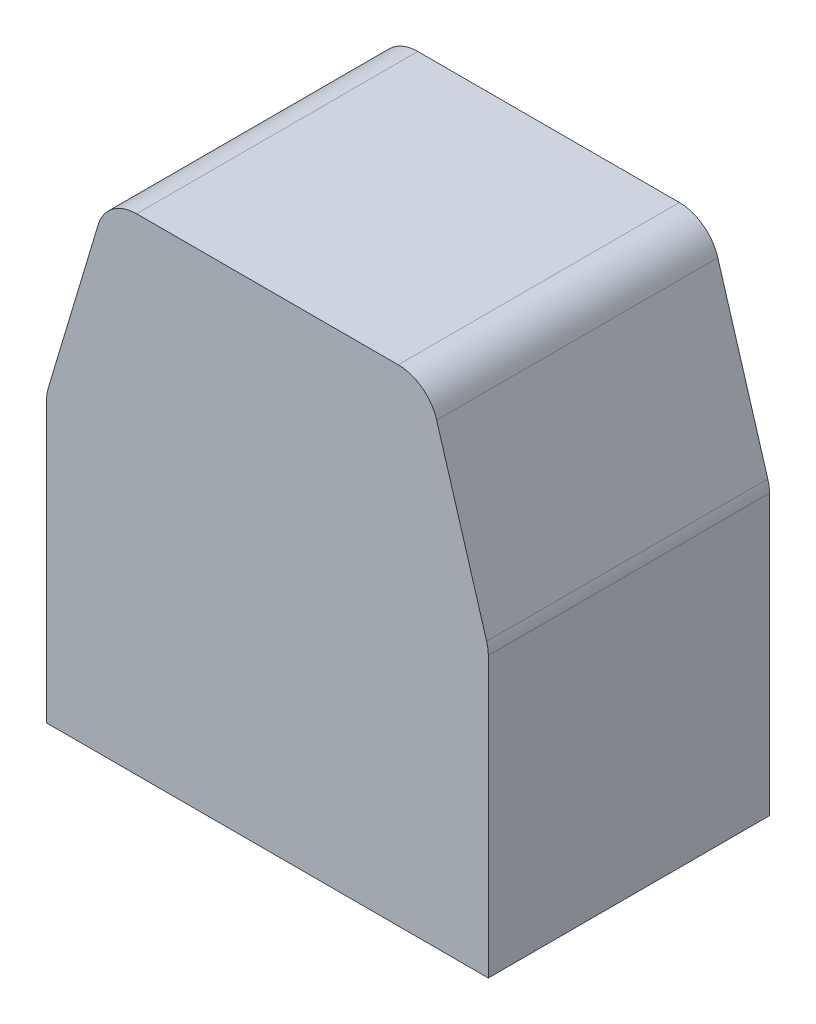
ISO-10303-21;
HEADER;
FILE_DESCRIPTION(('STEP AP214'),'2;1');
FILE_NAME('part.step','',(''),(''),'','','');
FILE_SCHEMA(('AUTOMOTIVE_DESIGN { 1 0 10303 214 1 1 1 1 }'));
ENDSEC;
DATA;
#1=APPLICATION_CONTEXT('core data for automotive mechanical design processes');
#2=APPLICATION_PROTOCOL_DEFINITION('international standard','automotive_design',2000,#1);
#3=PRODUCT_CONTEXT('',#1,'mechanical');
#4=PRODUCT('Part','Part','',(#3));
#5=PRODUCT_RELATED_PRODUCT_CATEGORY('part','',(#4));
#6=PRODUCT_DEFINITION_FORMATION('','',#4);
#7=PRODUCT_DEFINITION_CONTEXT('part definition',#1,'design');
#8=PRODUCT_DEFINITION('design','',#6,#7);
#9=PRODUCT_DEFINITION_SHAPE('','',#8);
#10=(LENGTH_UNIT() NAMED_UNIT(*) SI_UNIT(.MILLI.,.METRE.));
#11=(NAMED_UNIT(*) PLANE_ANGLE_UNIT() SI_UNIT($,.RADIAN.));
#12=(NAMED_UNIT(*) SI_UNIT($,.STERADIAN.) SOLID_ANGLE_UNIT());
#13=UNCERTAINTY_MEASURE_WITH_UNIT(LENGTH_MEASURE(1.E-05),#10,'distance_accuracy_value','');
#14=(GEOMETRIC_REPRESENTATION_CONTEXT(3) GLOBAL_UNCERTAINTY_ASSIGNED_CONTEXT((#13)) GLOBAL_UNIT_ASSIGNED_CONTEXT((#10,
#11,#12)) REPRESENTATION_CONTEXT('',''));
#15=CARTESIAN_POINT('',(0.,0.,0.));
#16=DIRECTION('',(0.,0.,1.));
#17=DIRECTION('',(1.,0.,0.));
#18=AXIS2_PLACEMENT_3D('',#15,#16,#17);
#19=CARTESIAN_POINT('',(-29.0596934910895,70.5,70.));
#20=DIRECTION('',(0.,0.,-1.));
#21=DIRECTION('',(-1.,0.,0.));
#22=AXIS2_PLACEMENT_3D('',#19,#20,#21);
#23=CYLINDRICAL_SURFACE('',#22,9.99999999999999);
#24=DIRECTION('',(0.,0.,-1.));
#25=VECTOR('',#24,1.);
#26=CARTESIAN_POINT('',(-29.0596934910895,80.5,70.));
#27=LINE('',#26,#25);
#28=CARTESIAN_POINT('',(-29.0596934910895,80.5,65.));
#29=VERTEX_POINT('',#28);
#30=CARTESIAN_POINT('',(-29.0596934910895,80.5,0.));
#31=VERTEX_POINT('',#30);
#32=EDGE_CURVE('E11',#29,#31,#27,.T.);
#33=ORIENTED_EDGE('',*,*,#32,.F.);
#34=CARTESIAN_POINT('',(-29.0596934910895,70.5,65.));
#35=DIRECTION('',(0.,0.,1.));
#36=DIRECTION('',(1.,0.,0.));
#37=AXIS2_PLACEMENT_3D('',#34,#35,#36);
#38=CIRCLE('',#37,9.99999999999999);
#39=CARTESIAN_POINT('',(-38.637956343301,73.3734788556635,65.));
#40=VERTEX_POINT('',#39);
#41=EDGE_CURVE('E511',#29,#40,#38,.T.);
#42=ORIENTED_EDGE('',*,*,#41,.T.);
#43=DIRECTION('',(0.,0.,-1.));
#44=VECTOR('',#43,1.);
#45=CARTESIAN_POINT('',(-38.637956343301,73.3734788556635,70.));
#46=LINE('',#45,#44);
#47=CARTESIAN_POINT('',(-38.637956343301,73.3734788556635,0.));
#48=VERTEX_POINT('',#47);
#49=EDGE_CURVE('E152',#40,#48,#46,.T.);
#50=ORIENTED_EDGE('',*,*,#49,.T.);
#51=CARTESIAN_POINT('',(-29.0596934910895,70.5,0.));
#52=DIRECTION('',(0.,0.,1.));
#53=DIRECTION('',(1.,0.,0.));
#54=AXIS2_PLACEMENT_3D('',#51,#52,#53);
#55=CIRCLE('',#54,9.99999999999999);
#56=EDGE_CURVE('E215',#31,#48,#55,.T.);
#57=ORIENTED_EDGE('',*,*,#56,.F.);
#58=EDGE_LOOP('',(#33,#42,#50,#57));
#59=FACE_BOUND('',#58,.T.);
#60=ADVANCED_FACE('F43',(#59),#23,.F.);
#61=CARTESIAN_POINT('',(0.,80.5,70.));
#62=DIRECTION('',(0.,1.,0.));
#63=DIRECTION('',(0.,0.,1.));
#64=AXIS2_PLACEMENT_3D('',#61,#62,#63);
#65=PLANE('',#64);
#66=DIRECTION('',(-1.,0.,0.));
#67=VECTOR('',#66,1.);
#68=CARTESIAN_POINT('',(-29.0596934910895,80.5,65.));
#69=LINE('',#68,#67);
#70=CARTESIAN_POINT('',(29.0596934910895,80.5,65.));
#71=VERTEX_POINT('',#70);
#72=EDGE_CURVE('E525',#71,#29,#69,.T.);
#73=ORIENTED_EDGE('',*,*,#72,.T.);
#74=ORIENTED_EDGE('',*,*,#32,.T.);
#75=DIRECTION('',(1.,0.,0.));
#76=VECTOR('',#75,1.);
#77=CARTESIAN_POINT('',(0.,80.5,0.));
#78=LINE('',#77,#76);
#79=CARTESIAN_POINT('',(29.0596934910895,80.5,0.));
#80=VERTEX_POINT('',#79);
#81=EDGE_CURVE('E219',#31,#80,#78,.T.);
#82=ORIENTED_EDGE('',*,*,#81,.T.);
#83=DIRECTION('',(0.,0.,-1.));
#84=VECTOR('',#83,1.);
#85=CARTESIAN_POINT('',(29.0596934910895,80.5,70.));
#86=LINE('',#85,#84);
#87=EDGE_CURVE('E52',#71,#80,#86,.T.);
#88=ORIENTED_EDGE('',*,*,#87,.F.);
#89=EDGE_LOOP('',(#73,#74,#82,#88));
#90=FACE_BOUND('',#89,.T.);
#91=ADVANCED_FACE('F389',(#90),#65,.F.);
#92=CARTESIAN_POINT('',(29.0596934910895,70.5,70.));
#93=DIRECTION('',(0.,0.,-1.));
#94=DIRECTION('',(-1.,0.,0.));
#95=AXIS2_PLACEMENT_3D('',#92,#93,#94);
#96=CYLINDRICAL_SURFACE('',#95,9.99999999999998);
#97=DIRECTION('',(0.,0.,-1.));
#98=VECTOR('',#97,1.);
#99=CARTESIAN_POINT('',(38.6379563433009,73.3734788556635,70.));
#100=LINE('',#99,#98);
#101=CARTESIAN_POINT('',(38.6379563433009,73.3734788556635,65.));
#102=VERTEX_POINT('',#101);
#103=CARTESIAN_POINT('',(38.6379563433009,73.3734788556635,0.));
#104=VERTEX_POINT('',#103);
#105=EDGE_CURVE('E374',#102,#104,#100,.T.);
#106=ORIENTED_EDGE('',*,*,#105,.F.);
#107=CARTESIAN_POINT('',(29.0596934910895,70.5,65.));
#108=DIRECTION('',(0.,0.,1.));
#109=DIRECTION('',(1.,0.,0.));
#110=AXIS2_PLACEMENT_3D('',#107,#108,#109);
#111=CIRCLE('',#110,9.99999999999998);
#112=EDGE_CURVE('E385',#102,#71,#111,.T.);
#113=ORIENTED_EDGE('',*,*,#112,.T.);
#114=ORIENTED_EDGE('',*,*,#87,.T.);
#115=CARTESIAN_POINT('',(29.0596934910895,70.5,0.));
#116=DIRECTION('',(0.,0.,1.));
#117=DIRECTION('',(1.,0.,0.));
#118=AXIS2_PLACEMENT_3D('',#115,#116,#117);
#119=CIRCLE('',#118,9.99999999999998);
#120=EDGE_CURVE('E224',#104,#80,#119,.T.);
#121=ORIENTED_EDGE('',*,*,#120,.F.);
#122=EDGE_LOOP('',(#106,#113,#114,#121));
#123=FACE_BOUND('',#122,.T.);
#124=ADVANCED_FACE('F382',(#123),#96,.F.);
#125=CARTESIAN_POINT('',(55.6422018348624,16.6926605504587,70.));
#126=DIRECTION('',(0.957826285221151,0.287347885566345,0.));
#127=DIRECTION('',(-0.287347885566345,0.957826285221152,0.));
#128=AXIS2_PLACEMENT_3D('',#125,#126,#127);
#129=PLANE('',#128);
#130=DIRECTION('',(-0.287347885566345,0.957826285221152,0.));
#131=VECTOR('',#130,1.);
#132=CARTESIAN_POINT('',(38.6379563433009,73.3734788556635,65.));
#133=LINE('',#132,#131);
#134=CARTESIAN_POINT('',(50.,35.4999999999998,65.));
#135=VERTEX_POINT('',#134);
#136=EDGE_CURVE('E403',#135,#102,#133,.T.);
#137=ORIENTED_EDGE('',*,*,#136,.T.);
#138=ORIENTED_EDGE('',*,*,#105,.T.);
#139=DIRECTION('',(0.287347885566345,-0.957826285221152,0.));
#140=VECTOR('',#139,1.);
#141=CARTESIAN_POINT('',(55.6422018348624,16.6926605504587,0.));
#142=LINE('',#141,#140);
#143=CARTESIAN_POINT('',(50.,35.4999999999998,0.));
#144=VERTEX_POINT('',#143);
#145=EDGE_CURVE('E228',#104,#144,#142,.T.);
#146=ORIENTED_EDGE('',*,*,#145,.T.);
#147=DIRECTION('',(0.,0.,-1.));
#148=VECTOR('',#147,1.);
#149=CARTESIAN_POINT('',(50.,35.4999999999998,70.));
#150=LINE('',#149,#148);
#151=EDGE_CURVE('E371',#135,#144,#150,.T.);
#152=ORIENTED_EDGE('',*,*,#151,.F.);
#153=EDGE_LOOP('',(#137,#138,#146,#152));
#154=FACE_BOUND('',#153,.T.);
#155=ADVANCED_FACE('F399',(#154),#129,.F.);
#156=CARTESIAN_POINT('',(49.9999999999999,-2.41809939075555E-13,70.));
#157=DIRECTION('',(1.,0.,0.));
#158=DIRECTION('',(0.,1.,0.));
#159=AXIS2_PLACEMENT_3D('',#156,#157,#158);
#160=PLANE('',#159);
#161=DIRECTION('',(0.,1.,0.));
#162=VECTOR('',#161,1.);
#163=CARTESIAN_POINT('',(50.,35.4999999999998,65.));
#164=LINE('',#163,#162);
#165=CARTESIAN_POINT('',(49.9999999999997,-30.5,65.));
#166=VERTEX_POINT('',#165);
#167=EDGE_CURVE('E534',#166,#135,#164,.T.);
#168=ORIENTED_EDGE('',*,*,#167,.T.);
#169=ORIENTED_EDGE('',*,*,#151,.T.);
#170=DIRECTION('',(0.,-1.,0.));
#171=VECTOR('',#170,1.);
#172=CARTESIAN_POINT('',(49.9999999999999,-2.41809939075555E-13,0.));
#173=LINE('',#172,#171);
#174=CARTESIAN_POINT('',(49.9999999999997,-30.5,0.));
#175=VERTEX_POINT('',#174);
#176=EDGE_CURVE('E232',#144,#175,#173,.T.);
#177=ORIENTED_EDGE('',*,*,#176,.T.);
#178=DIRECTION('',(0.,0.,-1.));
#179=VECTOR('',#178,1.);
#180=CARTESIAN_POINT('',(49.9999999999997,-30.5,70.));
#181=LINE('',#180,#179);
#182=EDGE_CURVE('E368',#166,#175,#181,.T.);
#183=ORIENTED_EDGE('',*,*,#182,.F.);
#184=EDGE_LOOP('',(#168,#169,#177,#183));
#185=FACE_BOUND('',#184,.T.);
#186=ADVANCED_FACE('F600',(#185),#160,.F.);
#187=CARTESIAN_POINT('',(25.7068874077128,-44.5256350946108,70.));
#188=DIRECTION('',(-0.500000000000002,0.866025403784437,0.));
#189=DIRECTION('',(-0.866025403784437,-0.500000000000002,0.));
#190=AXIS2_PLACEMENT_3D('',#187,#188,#189);
#191=PLANE('',#190);
#192=DIRECTION('',(-0.866025403784437,-0.500000000000002,0.));
#193=VECTOR('',#192,1.);
#194=CARTESIAN_POINT('',(49.9999999999997,-30.5,65.));
#195=LINE('',#194,#193);
#196=CARTESIAN_POINT('',(52.598076211353,-29.,65.));
#197=VERTEX_POINT('',#196);
#198=EDGE_CURVE('E538',#197,#166,#195,.T.);
#199=ORIENTED_EDGE('',*,*,#198,.T.);
#200=ORIENTED_EDGE('',*,*,#182,.T.);
#201=DIRECTION('',(0.866025403784437,0.500000000000002,0.));
#202=VECTOR('',#201,1.);
#203=CARTESIAN_POINT('',(25.7068874077128,-44.5256350946108,0.));
#204=LINE('',#203,#202);
#205=CARTESIAN_POINT('',(52.598076211353,-29.,0.));
#206=VERTEX_POINT('',#205);
#207=EDGE_CURVE('E236',#175,#206,#204,.T.);
#208=ORIENTED_EDGE('',*,*,#207,.T.);
#209=DIRECTION('',(0.,0.,-1.));
#210=VECTOR('',#209,1.);
#211=CARTESIAN_POINT('',(52.598076211353,-29.,70.));
#212=LINE('',#211,#210);
#213=EDGE_CURVE('E365',#197,#206,#212,.T.);
#214=ORIENTED_EDGE('',*,*,#213,.F.);
#215=EDGE_LOOP('',(#199,#200,#208,#214));
#216=FACE_BOUND('',#215,.T.);
#217=ADVANCED_FACE('F596',(#216),#191,.F.);
#218=CARTESIAN_POINT('',(52.598076211353,0.,70.));
#219=DIRECTION('',(1.,0.,0.));
#220=DIRECTION('',(0.,0.,-1.));
#221=AXIS2_PLACEMENT_3D('',#218,#219,#220);
#222=PLANE('',#221);
#223=DIRECTION('',(0.,1.,0.));
#224=VECTOR('',#223,1.);
#225=CARTESIAN_POINT('',(52.598076211353,-29.,65.));
#226=LINE('',#225,#224);
#227=CARTESIAN_POINT('',(52.598076211353,-34.,65.));
#228=VERTEX_POINT('',#227);
#229=EDGE_CURVE('E542',#228,#197,#226,.T.);
#230=ORIENTED_EDGE('',*,*,#229,.T.);
#231=ORIENTED_EDGE('',*,*,#213,.T.);
#232=DIRECTION('',(0.,-1.,0.));
#233=VECTOR('',#232,1.);
#234=CARTESIAN_POINT('',(52.598076211353,0.,0.));
#235=LINE('',#234,#233);
#236=CARTESIAN_POINT('',(52.598076211353,-34.,0.));
#237=VERTEX_POINT('',#236);
#238=EDGE_CURVE('E240',#206,#237,#235,.T.);
#239=ORIENTED_EDGE('',*,*,#238,.T.);
#240=DIRECTION('',(0.,0.,-1.));
#241=VECTOR('',#240,1.);
#242=CARTESIAN_POINT('',(52.598076211353,-34.,70.));
#243=LINE('',#242,#241);
#244=EDGE_CURVE('E362',#228,#237,#243,.T.);
#245=ORIENTED_EDGE('',*,*,#244,.F.);
#246=EDGE_LOOP('',(#230,#231,#239,#245));
#247=FACE_BOUND('',#246,.T.);
#248=ADVANCED_FACE('F592',(#247),#222,.F.);
#249=CARTESIAN_POINT('',(-1.57291281149709,-2.72436490538894,70.));
#250=DIRECTION('',(-0.500000000000004,-0.866025403784437,0.));
#251=DIRECTION('',(0.866025403784437,-0.500000000000004,0.));
#252=AXIS2_PLACEMENT_3D('',#249,#250,#251);
#253=PLANE('',#252);
#254=DIRECTION('',(0.866025403784437,-0.500000000000004,0.));
#255=VECTOR('',#254,1.);
#256=CARTESIAN_POINT('',(52.598076211353,-34.,65.));
#257=LINE('',#256,#255);
#258=CARTESIAN_POINT('',(49.9999999999997,-32.5,65.));
#259=VERTEX_POINT('',#258);
#260=EDGE_CURVE('E546',#259,#228,#257,.T.);
#261=ORIENTED_EDGE('',*,*,#260,.T.);
#262=ORIENTED_EDGE('',*,*,#244,.T.);
#263=DIRECTION('',(-0.866025403784437,0.500000000000004,0.));
#264=VECTOR('',#263,1.);
#265=CARTESIAN_POINT('',(-1.57291281149709,-2.72436490538894,0.));
#266=LINE('',#265,#264);
#267=CARTESIAN_POINT('',(49.9999999999997,-32.5,0.));
#268=VERTEX_POINT('',#267);
#269=EDGE_CURVE('E244',#237,#268,#266,.T.);
#270=ORIENTED_EDGE('',*,*,#269,.T.);
#271=DIRECTION('',(0.,0.,-1.));
#272=VECTOR('',#271,1.);
#273=CARTESIAN_POINT('',(49.9999999999997,-32.5,70.));
#274=LINE('',#273,#272);
#275=EDGE_CURVE('E359',#259,#268,#274,.T.);
#276=ORIENTED_EDGE('',*,*,#275,.F.);
#277=EDGE_LOOP('',(#261,#262,#270,#276));
#278=FACE_BOUND('',#277,.T.);
#279=ADVANCED_FACE('F589',(#278),#253,.F.);
#280=CARTESIAN_POINT('',(49.9999999999998,-2.15007980121054E-13,70.));
#281=DIRECTION('',(1.,0.,0.));
#282=DIRECTION('',(0.,1.,0.));
#283=AXIS2_PLACEMENT_3D('',#280,#281,#282);
#284=PLANE('',#283);
#285=DIRECTION('',(0.,1.,0.));
#286=VECTOR('',#285,1.);
#287=CARTESIAN_POINT('',(49.9999999999997,-32.5,65.));
#288=LINE('',#287,#286);
#289=CARTESIAN_POINT('',(49.9999999999997,-35.5,65.));
#290=VERTEX_POINT('',#289);
#291=EDGE_CURVE('E550',#290,#259,#288,.T.);
#292=ORIENTED_EDGE('',*,*,#291,.T.);
#293=ORIENTED_EDGE('',*,*,#275,.T.);
#294=DIRECTION('',(0.,-1.,0.));
#295=VECTOR('',#294,1.);
#296=CARTESIAN_POINT('',(49.9999999999998,-2.15007980121054E-13,0.));
#297=LINE('',#296,#295);
#298=CARTESIAN_POINT('',(49.9999999999997,-35.5,0.));
#299=VERTEX_POINT('',#298);
#300=EDGE_CURVE('E248',#268,#299,#297,.T.);
#301=ORIENTED_EDGE('',*,*,#300,.T.);
#302=DIRECTION('',(0.,0.,-1.));
#303=VECTOR('',#302,1.);
#304=CARTESIAN_POINT('',(49.9999999999997,-35.5,70.));
#305=LINE('',#304,#303);
#306=EDGE_CURVE('E356',#290,#299,#305,.T.);
#307=ORIENTED_EDGE('',*,*,#306,.F.);
#308=EDGE_LOOP('',(#292,#293,#301,#307));
#309=FACE_BOUND('',#308,.T.);
#310=ADVANCED_FACE('F561',(#309),#284,.F.);
#311=CARTESIAN_POINT('',(-49.9999999999999,1.07503990060534E-13,70.));
#312=DIRECTION('',(1.,0.,0.));
#313=DIRECTION('',(0.,1.,0.));
#314=AXIS2_PLACEMENT_3D('',#311,#312,#313);
#315=PLANE('',#314);
#316=DIRECTION('',(0.,0.,-1.));
#317=VECTOR('',#316,1.);
#318=CARTESIAN_POINT('',(-50.,-32.5,70.));
#319=LINE('',#318,#317);
#320=CARTESIAN_POINT('',(-50.,-32.5,65.));
#321=VERTEX_POINT('',#320);
#322=CARTESIAN_POINT('',(-50.,-32.5,0.));
#323=VERTEX_POINT('',#322);
#324=EDGE_CURVE('E325',#321,#323,#319,.T.);
#325=ORIENTED_EDGE('',*,*,#324,.F.);
#326=DIRECTION('',(0.,-1.,0.));
#327=VECTOR('',#326,1.);
#328=CARTESIAN_POINT('',(-50.,-35.5,65.));
#329=LINE('',#328,#327);
#330=CARTESIAN_POINT('',(-50.,-35.5,65.));
#331=VERTEX_POINT('',#330);
#332=EDGE_CURVE('E433',#321,#331,#329,.T.);
#333=ORIENTED_EDGE('',*,*,#332,.T.);
#334=DIRECTION('',(0.,0.,-1.));
#335=VECTOR('',#334,1.);
#336=CARTESIAN_POINT('',(-50.,-35.5,70.));
#337=LINE('',#336,#335);
#338=CARTESIAN_POINT('',(-50.,-35.5,0.));
#339=VERTEX_POINT('',#338);
#340=EDGE_CURVE('E328',#331,#339,#337,.T.);
#341=ORIENTED_EDGE('',*,*,#340,.T.);
#342=DIRECTION('',(0.,-1.,0.));
#343=VECTOR('',#342,1.);
#344=CARTESIAN_POINT('',(-49.9999999999999,1.07503990060534E-13,0.));
#345=LINE('',#344,#343);
#346=EDGE_CURVE('E289',#323,#339,#345,.T.);
#347=ORIENTED_EDGE('',*,*,#346,.F.);
#348=EDGE_LOOP('',(#325,#333,#341,#347));
#349=FACE_BOUND('',#348,.T.);
#350=ADVANCED_FACE('F452',(#349),#315,.T.);
#351=CARTESIAN_POINT('',(1.57291281149704,-2.72436490538885,70.));
#352=DIRECTION('',(-0.500000000000003,0.866025403784437,0.));
#353=DIRECTION('',(-0.866025403784437,-0.500000000000003,0.));
#354=AXIS2_PLACEMENT_3D('',#351,#352,#353);
#355=PLANE('',#354);
#356=DIRECTION('',(0.,0.,-1.));
#357=VECTOR('',#356,1.);
#358=CARTESIAN_POINT('',(-52.5980762113533,-34.,70.));
#359=LINE('',#358,#357);
#360=CARTESIAN_POINT('',(-52.5980762113533,-34.,65.));
#361=VERTEX_POINT('',#360);
#362=CARTESIAN_POINT('',(-52.5980762113533,-34.,0.));
#363=VERTEX_POINT('',#362);
#364=EDGE_CURVE('E322',#361,#363,#359,.T.);
#365=ORIENTED_EDGE('',*,*,#364,.F.);
#366=DIRECTION('',(0.866025403784437,0.500000000000003,0.));
#367=VECTOR('',#366,1.);
#368=CARTESIAN_POINT('',(-50.,-32.5,65.));
#369=LINE('',#368,#367);
#370=EDGE_CURVE('E220',#361,#321,#369,.T.);
#371=ORIENTED_EDGE('',*,*,#370,.T.);
#372=ORIENTED_EDGE('',*,*,#324,.T.);
#373=DIRECTION('',(0.866025403784437,0.500000000000003,0.));
#374=VECTOR('',#373,1.);
#375=CARTESIAN_POINT('',(1.57291281149704,-2.72436490538885,0.));
#376=LINE('',#375,#374);
#377=EDGE_CURVE('E293',#363,#323,#376,.T.);
#378=ORIENTED_EDGE('',*,*,#377,.F.);
#379=EDGE_LOOP('',(#365,#371,#372,#378));
#380=FACE_BOUND('',#379,.T.);
#381=ADVANCED_FACE('F446',(#380),#355,.T.);
#382=CARTESIAN_POINT('',(-52.5980762113534,-1.45988988152083E-13,70.));
#383=DIRECTION('',(1.,0.,0.));
#384=DIRECTION('',(0.,1.,0.));
#385=AXIS2_PLACEMENT_3D('',#382,#383,#384);
#386=PLANE('',#385);
#387=DIRECTION('',(0.,0.,-1.));
#388=VECTOR('',#387,1.);
#389=CARTESIAN_POINT('',(-52.5980762113533,-29.,70.));
#390=LINE('',#389,#388);
#391=CARTESIAN_POINT('',(-52.5980762113533,-29.,65.));
#392=VERTEX_POINT('',#391);
#393=CARTESIAN_POINT('',(-52.5980762113533,-29.,0.));
#394=VERTEX_POINT('',#393);
#395=EDGE_CURVE('E319',#392,#394,#390,.T.);
#396=ORIENTED_EDGE('',*,*,#395,.F.);
#397=DIRECTION('',(0.,-1.,0.));
#398=VECTOR('',#397,1.);
#399=CARTESIAN_POINT('',(-52.5980762113533,-34.,65.));
#400=LINE('',#399,#398);
#401=EDGE_CURVE('E450',#392,#361,#400,.T.);
#402=ORIENTED_EDGE('',*,*,#401,.T.);
#403=ORIENTED_EDGE('',*,*,#364,.T.);
#404=DIRECTION('',(0.,-1.,0.));
#405=VECTOR('',#404,1.);
#406=CARTESIAN_POINT('',(-52.5980762113534,-1.45988988152083E-13,0.));
#407=LINE('',#406,#405);
#408=EDGE_CURVE('E297',#394,#363,#407,.T.);
#409=ORIENTED_EDGE('',*,*,#408,.F.);
#410=EDGE_LOOP('',(#396,#402,#403,#409));
#411=FACE_BOUND('',#410,.T.);
#412=ADVANCED_FACE('F459',(#411),#386,.T.);
#413=CARTESIAN_POINT('',(-25.706887407713,-44.525635094611,70.));
#414=DIRECTION('',(-0.500000000000004,-0.866025403784436,0.));
#415=DIRECTION('',(0.866025403784436,-0.500000000000005,0.));
#416=AXIS2_PLACEMENT_3D('',#413,#414,#415);
#417=PLANE('',#416);
#418=DIRECTION('',(0.,0.,-1.));
#419=VECTOR('',#418,1.);
#420=CARTESIAN_POINT('',(-50.,-30.5,70.));
#421=LINE('',#420,#419);
#422=CARTESIAN_POINT('',(-50.,-30.5,65.));
#423=VERTEX_POINT('',#422);
#424=CARTESIAN_POINT('',(-50.,-30.5,0.));
#425=VERTEX_POINT('',#424);
#426=EDGE_CURVE('E316',#423,#425,#421,.T.);
#427=ORIENTED_EDGE('',*,*,#426,.F.);
#428=DIRECTION('',(-0.866025403784437,0.500000000000004,0.));
#429=VECTOR('',#428,1.);
#430=CARTESIAN_POINT('',(-52.5980762113533,-29.,65.));
#431=LINE('',#430,#429);
#432=EDGE_CURVE('E462',#423,#392,#431,.T.);
#433=ORIENTED_EDGE('',*,*,#432,.T.);
#434=ORIENTED_EDGE('',*,*,#395,.T.);
#435=DIRECTION('',(-0.866025403784436,0.500000000000005,0.));
#436=VECTOR('',#435,1.);
#437=CARTESIAN_POINT('',(-25.706887407713,-44.525635094611,0.));
#438=LINE('',#437,#436);
#439=EDGE_CURVE('E301',#425,#394,#438,.T.);
#440=ORIENTED_EDGE('',*,*,#439,.F.);
#441=EDGE_LOOP('',(#427,#433,#434,#440));
#442=FACE_BOUND('',#441,.T.);
#443=ADVANCED_FACE('F518',(#442),#417,.T.);
#444=CARTESIAN_POINT('',(-50.,0.,70.));
#445=DIRECTION('',(1.,0.,0.));
#446=DIRECTION('',(0.,1.,0.));
#447=AXIS2_PLACEMENT_3D('',#444,#445,#446);
#448=PLANE('',#447);
#449=DIRECTION('',(0.,0.,-1.));
#450=VECTOR('',#449,1.);
#451=CARTESIAN_POINT('',(-50.,35.5,70.));
#452=LINE('',#451,#450);
#453=CARTESIAN_POINT('',(-50.,35.5,65.));
#454=VERTEX_POINT('',#453);
#455=CARTESIAN_POINT('',(-50.,35.5,0.));
#456=VERTEX_POINT('',#455);
#457=EDGE_CURVE('E144',#454,#456,#452,.T.);
#458=ORIENTED_EDGE('',*,*,#457,.F.);
#459=DIRECTION('',(0.,-1.,0.));
#460=VECTOR('',#459,1.);
#461=CARTESIAN_POINT('',(-50.,-30.5,65.));
#462=LINE('',#461,#460);
#463=EDGE_CURVE('E465',#454,#423,#462,.T.);
#464=ORIENTED_EDGE('',*,*,#463,.T.);
#465=ORIENTED_EDGE('',*,*,#426,.T.);
#466=DIRECTION('',(0.,-1.,0.));
#467=VECTOR('',#466,1.);
#468=CARTESIAN_POINT('',(-50.,0.,0.));
#469=LINE('',#468,#467);
#470=EDGE_CURVE('E305',#456,#425,#469,.T.);
#471=ORIENTED_EDGE('',*,*,#470,.F.);
#472=EDGE_LOOP('',(#458,#464,#465,#471));
#473=FACE_BOUND('',#472,.T.);
#474=ADVANCED_FACE('F514',(#473),#448,.T.);
#475=CARTESIAN_POINT('',(-55.6422018348624,16.6926605504587,70.));
#476=DIRECTION('',(-0.957826285221151,0.287347885566345,0.));
#477=DIRECTION('',(-0.287347885566345,-0.957826285221152,0.));
#478=AXIS2_PLACEMENT_3D('',#475,#476,#477);
#479=PLANE('',#478);
#480=DIRECTION('',(-0.287347885566345,-0.957826285221151,0.));
#481=VECTOR('',#480,1.);
#482=CARTESIAN_POINT('',(-50.,35.5,65.));
#483=LINE('',#482,#481);
#484=EDGE_CURVE('E519',#40,#454,#483,.T.);
#485=ORIENTED_EDGE('',*,*,#484,.T.);
#486=ORIENTED_EDGE('',*,*,#457,.T.);
#487=DIRECTION('',(0.287347885566345,0.957826285221152,0.));
#488=VECTOR('',#487,1.);
#489=CARTESIAN_POINT('',(-55.6422018348624,16.6926605504587,0.));
#490=LINE('',#489,#488);
#491=EDGE_CURVE('E309',#456,#48,#490,.T.);
#492=ORIENTED_EDGE('',*,*,#491,.T.);
#493=ORIENTED_EDGE('',*,*,#49,.F.);
#494=EDGE_LOOP('',(#485,#486,#492,#493));
#495=FACE_BOUND('',#494,.T.);
#496=ADVANCED_FACE('F521',(#495),#479,.F.);
#497=CARTESIAN_POINT('',(55.,0.,70.));
#498=DIRECTION('',(1.,0.,0.));
#499=DIRECTION('',(0.,1.,0.));
#500=AXIS2_PLACEMENT_3D('',#497,#498,#499);
#501=PLANE('',#500);
#502=DIRECTION('',(0.,-1.,0.));
#503=VECTOR('',#502,1.);
#504=CARTESIAN_POINT('',(55.,0.,0.));
#505=LINE('',#504,#503);
#506=CARTESIAN_POINT('',(55.,34.0323116369648,0.));
#507=VERTEX_POINT('',#506);
#508=CARTESIAN_POINT('',(55.,-35.5,0.));
#509=VERTEX_POINT('',#508);
#510=EDGE_CURVE('E256',#507,#509,#505,.T.);
#511=ORIENTED_EDGE('',*,*,#510,.F.);
#512=DIRECTION('',(0.,0.,-1.));
#513=VECTOR('',#512,1.);
#514=CARTESIAN_POINT('',(55.,34.0323116369648,70.));
#515=LINE('',#514,#513);
#516=CARTESIAN_POINT('',(55.,34.0323116369648,70.));
#517=VERTEX_POINT('',#516);
#518=EDGE_CURVE('E350',#517,#507,#515,.T.);
#519=ORIENTED_EDGE('',*,*,#518,.F.);
#520=DIRECTION('',(0.,-1.,0.));
#521=VECTOR('',#520,1.);
#522=CARTESIAN_POINT('',(55.,0.,70.));
#523=LINE('',#522,#521);
#524=CARTESIAN_POINT('',(55.,-35.5,70.));
#525=VERTEX_POINT('',#524);
#526=EDGE_CURVE('E471',#517,#525,#523,.T.);
#527=ORIENTED_EDGE('',*,*,#526,.T.);
#528=DIRECTION('',(0.,0.,-1.));
#529=VECTOR('',#528,1.);
#530=CARTESIAN_POINT('',(55.,-35.5,70.));
#531=LINE('',#530,#529);
#532=EDGE_CURVE('E353',#525,#509,#531,.T.);
#533=ORIENTED_EDGE('',*,*,#532,.T.);
#534=EDGE_LOOP('',(#511,#519,#527,#533));
#535=FACE_BOUND('',#534,.T.);
#536=ADVANCED_FACE('F569',(#535),#501,.T.);
#537=CARTESIAN_POINT('',(45.,34.0323116369648,70.));
#538=DIRECTION('',(0.,0.,-1.));
#539=DIRECTION('',(-1.,0.,0.));
#540=AXIS2_PLACEMENT_3D('',#537,#538,#539);
#541=CYLINDRICAL_SURFACE('',#540,10.);
#542=CARTESIAN_POINT('',(45.,34.0323116369648,0.));
#543=DIRECTION('',(0.,0.,1.));
#544=DIRECTION('',(1.,0.,0.));
#545=AXIS2_PLACEMENT_3D('',#542,#543,#544);
#546=CIRCLE('',#545,10.);
#547=CARTESIAN_POINT('',(54.5782628522115,36.9057904926283,0.));
#548=VERTEX_POINT('',#547);
#549=EDGE_CURVE('E261',#507,#548,#546,.T.);
#550=ORIENTED_EDGE('',*,*,#549,.T.);
#551=DIRECTION('',(0.,0.,-1.));
#552=VECTOR('',#551,1.);
#553=CARTESIAN_POINT('',(54.5782628522115,36.9057904926283,70.));
#554=LINE('',#553,#552);
#555=CARTESIAN_POINT('',(54.5782628522115,36.9057904926283,70.));
#556=VERTEX_POINT('',#555);
#557=EDGE_CURVE('E347',#556,#548,#554,.T.);
#558=ORIENTED_EDGE('',*,*,#557,.F.);
#559=CARTESIAN_POINT('',(45.,34.0323116369648,70.));
#560=DIRECTION('',(0.,0.,1.));
#561=DIRECTION('',(1.,0.,0.));
#562=AXIS2_PLACEMENT_3D('',#559,#560,#561);
#563=CIRCLE('',#562,10.);
#564=EDGE_CURVE('E475',#517,#556,#563,.T.);
#565=ORIENTED_EDGE('',*,*,#564,.F.);
#566=ORIENTED_EDGE('',*,*,#518,.T.);
#567=EDGE_LOOP('',(#550,#558,#565,#566));
#568=FACE_BOUND('',#567,.T.);
#569=ADVANCED_FACE('F573',(#568),#541,.T.);
#570=CARTESIAN_POINT('',(60.2293577981651,18.0688073394495,70.));
#571=DIRECTION('',(0.957826285221152,0.287347885566345,0.));
#572=DIRECTION('',(-0.287347885566345,0.957826285221152,0.));
#573=AXIS2_PLACEMENT_3D('',#570,#571,#572);
#574=PLANE('',#573);
#575=DIRECTION('',(0.287347885566345,-0.957826285221151,0.));
#576=VECTOR('',#575,1.);
#577=CARTESIAN_POINT('',(60.2293577981651,18.0688073394495,0.));
#578=LINE('',#577,#576);
#579=CARTESIAN_POINT('',(42.137956343301,78.3734788556635,0.));
#580=VERTEX_POINT('',#579);
#581=EDGE_CURVE('E265',#580,#548,#578,.T.);
#582=ORIENTED_EDGE('',*,*,#581,.F.);
#583=DIRECTION('',(0.,0.,-1.));
#584=VECTOR('',#583,1.);
#585=CARTESIAN_POINT('',(42.137956343301,78.3734788556635,70.));
#586=LINE('',#585,#584);
#587=CARTESIAN_POINT('',(42.137956343301,78.3734788556635,70.));
#588=VERTEX_POINT('',#587);
#589=EDGE_CURVE('E344',#588,#580,#586,.T.);
#590=ORIENTED_EDGE('',*,*,#589,.F.);
#591=DIRECTION('',(0.287347885566345,-0.957826285221151,0.));
#592=VECTOR('',#591,1.);
#593=CARTESIAN_POINT('',(60.2293577981651,18.0688073394495,70.));
#594=LINE('',#593,#592);
#595=EDGE_CURVE('E478',#588,#556,#594,.T.);
#596=ORIENTED_EDGE('',*,*,#595,.T.);
#597=ORIENTED_EDGE('',*,*,#557,.T.);
#598=EDGE_LOOP('',(#582,#590,#596,#597));
#599=FACE_BOUND('',#598,.T.);
#600=ADVANCED_FACE('F575',(#599),#574,.T.);
#601=CARTESIAN_POINT('',(32.5596934910894,75.5,70.));
#602=DIRECTION('',(0.,0.,-1.));
#603=DIRECTION('',(-1.,0.,0.));
#604=AXIS2_PLACEMENT_3D('',#601,#602,#603);
#605=CYLINDRICAL_SURFACE('',#604,10.);
#606=CARTESIAN_POINT('',(32.5596934910894,75.5,0.));
#607=DIRECTION('',(0.,0.,1.));
#608=DIRECTION('',(1.,0.,0.));
#609=AXIS2_PLACEMENT_3D('',#606,#607,#608);
#610=CIRCLE('',#609,10.);
#611=CARTESIAN_POINT('',(32.5596934910894,85.5,0.));
#612=VERTEX_POINT('',#611);
#613=EDGE_CURVE('E269',#580,#612,#610,.T.);
#614=ORIENTED_EDGE('',*,*,#613,.T.);
#615=DIRECTION('',(0.,0.,-1.));
#616=VECTOR('',#615,1.);
#617=CARTESIAN_POINT('',(32.5596934910894,85.5,70.));
#618=LINE('',#617,#616);
#619=CARTESIAN_POINT('',(32.5596934910894,85.5,70.));
#620=VERTEX_POINT('',#619);
#621=EDGE_CURVE('E341',#620,#612,#618,.T.);
#622=ORIENTED_EDGE('',*,*,#621,.F.);
#623=CARTESIAN_POINT('',(32.5596934910894,75.5,70.));
#624=DIRECTION('',(0.,0.,1.));
#625=DIRECTION('',(1.,0.,0.));
#626=AXIS2_PLACEMENT_3D('',#623,#624,#625);
#627=CIRCLE('',#626,10.);
#628=EDGE_CURVE('E482',#588,#620,#627,.T.);
#629=ORIENTED_EDGE('',*,*,#628,.F.);
#630=ORIENTED_EDGE('',*,*,#589,.T.);
#631=EDGE_LOOP('',(#614,#622,#629,#630));
#632=FACE_BOUND('',#631,.T.);
#633=ADVANCED_FACE('F493',(#632),#605,.T.);
#634=CARTESIAN_POINT('',(0.,85.5,70.));
#635=DIRECTION('',(0.,1.,0.));
#636=DIRECTION('',(0.,0.,1.));
#637=AXIS2_PLACEMENT_3D('',#634,#635,#636);
#638=PLANE('',#637);
#639=DIRECTION('',(1.,0.,0.));
#640=VECTOR('',#639,1.);
#641=CARTESIAN_POINT('',(0.,85.5,0.));
#642=LINE('',#641,#640);
#643=CARTESIAN_POINT('',(-32.5596934910895,85.5,0.));
#644=VERTEX_POINT('',#643);
#645=EDGE_CURVE('E273',#644,#612,#642,.T.);
#646=ORIENTED_EDGE('',*,*,#645,.F.);
#647=DIRECTION('',(0.,0.,-1.));
#648=VECTOR('',#647,1.);
#649=CARTESIAN_POINT('',(-32.5596934910895,85.5,70.));
#650=LINE('',#649,#648);
#651=CARTESIAN_POINT('',(-32.5596934910895,85.5,70.));
#652=VERTEX_POINT('',#651);
#653=EDGE_CURVE('E338',#652,#644,#650,.T.);
#654=ORIENTED_EDGE('',*,*,#653,.F.);
#655=DIRECTION('',(1.,0.,0.));
#656=VECTOR('',#655,1.);
#657=CARTESIAN_POINT('',(0.,85.5,70.));
#658=LINE('',#657,#656);
#659=EDGE_CURVE('E209',#652,#620,#658,.T.);
#660=ORIENTED_EDGE('',*,*,#659,.T.);
#661=ORIENTED_EDGE('',*,*,#621,.T.);
#662=EDGE_LOOP('',(#646,#654,#660,#661));
#663=FACE_BOUND('',#662,.T.);
#664=ADVANCED_FACE('F488',(#663),#638,.T.);
#665=CARTESIAN_POINT('',(-32.5596934910895,75.5,70.));
#666=DIRECTION('',(0.,0.,-1.));
#667=DIRECTION('',(-1.,0.,0.));
#668=AXIS2_PLACEMENT_3D('',#665,#666,#667);
#669=CYLINDRICAL_SURFACE('',#668,9.99999999999999);
#670=CARTESIAN_POINT('',(-32.5596934910895,75.5,0.));
#671=DIRECTION('',(0.,0.,1.));
#672=DIRECTION('',(1.,0.,0.));
#673=AXIS2_PLACEMENT_3D('',#670,#671,#672);
#674=CIRCLE('',#673,9.99999999999999);
#675=CARTESIAN_POINT('',(-42.137956343301,78.3734788556635,0.));
#676=VERTEX_POINT('',#675);
#677=EDGE_CURVE('E277',#644,#676,#674,.T.);
#678=ORIENTED_EDGE('',*,*,#677,.T.);
#679=DIRECTION('',(0.,0.,-1.));
#680=VECTOR('',#679,1.);
#681=CARTESIAN_POINT('',(-42.137956343301,78.3734788556635,70.));
#682=LINE('',#681,#680);
#683=CARTESIAN_POINT('',(-42.137956343301,78.3734788556635,70.));
#684=VERTEX_POINT('',#683);
#685=EDGE_CURVE('E190',#684,#676,#682,.T.);
#686=ORIENTED_EDGE('',*,*,#685,.F.);
#687=CARTESIAN_POINT('',(-32.5596934910895,75.5,70.));
#688=DIRECTION('',(0.,0.,1.));
#689=DIRECTION('',(1.,0.,0.));
#690=AXIS2_PLACEMENT_3D('',#687,#688,#689);
#691=CIRCLE('',#690,9.99999999999999);
#692=EDGE_CURVE('E204',#652,#684,#691,.T.);
#693=ORIENTED_EDGE('',*,*,#692,.F.);
#694=ORIENTED_EDGE('',*,*,#653,.T.);
#695=EDGE_LOOP('',(#678,#686,#693,#694));
#696=FACE_BOUND('',#695,.T.);
#697=ADVANCED_FACE('F498',(#696),#669,.T.);
#698=CARTESIAN_POINT('',(-60.2293577981651,18.0688073394495,70.));
#699=DIRECTION('',(-0.957826285221152,0.287347885566345,0.));
#700=DIRECTION('',(-0.287347885566345,-0.957826285221152,0.));
#701=AXIS2_PLACEMENT_3D('',#698,#699,#700);
#702=PLANE('',#701);
#703=DIRECTION('',(0.287347885566345,0.957826285221151,0.));
#704=VECTOR('',#703,1.);
#705=CARTESIAN_POINT('',(-60.2293577981651,18.0688073394495,0.));
#706=LINE('',#705,#704);
#707=CARTESIAN_POINT('',(-54.5782628522115,36.9057904926283,0.));
#708=VERTEX_POINT('',#707);
#709=EDGE_CURVE('E186',#708,#676,#706,.T.);
#710=ORIENTED_EDGE('',*,*,#709,.F.);
#711=DIRECTION('',(0.,0.,-1.));
#712=VECTOR('',#711,1.);
#713=CARTESIAN_POINT('',(-54.5782628522115,36.9057904926283,70.));
#714=LINE('',#713,#712);
#715=CARTESIAN_POINT('',(-54.5782628522115,36.9057904926283,70.));
#716=VERTEX_POINT('',#715);
#717=EDGE_CURVE('E180',#716,#708,#714,.T.);
#718=ORIENTED_EDGE('',*,*,#717,.F.);
#719=DIRECTION('',(0.287347885566345,0.957826285221151,0.));
#720=VECTOR('',#719,1.);
#721=CARTESIAN_POINT('',(-60.2293577981651,18.0688073394495,70.));
#722=LINE('',#721,#720);
#723=EDGE_CURVE('E184',#716,#684,#722,.T.);
#724=ORIENTED_EDGE('',*,*,#723,.T.);
#725=ORIENTED_EDGE('',*,*,#685,.T.);
#726=EDGE_LOOP('',(#710,#718,#724,#725));
#727=FACE_BOUND('',#726,.T.);
#728=ADVANCED_FACE('F182',(#727),#702,.T.);
#729=CARTESIAN_POINT('',(-45.,34.0323116369649,70.));
#730=DIRECTION('',(0.,0.,-1.));
#731=DIRECTION('',(-1.,0.,0.));
#732=AXIS2_PLACEMENT_3D('',#729,#730,#731);
#733=CYLINDRICAL_SURFACE('',#732,10.);
#734=CARTESIAN_POINT('',(-45.,34.0323116369649,0.));
#735=DIRECTION('',(0.,0.,1.));
#736=DIRECTION('',(1.,0.,0.));
#737=AXIS2_PLACEMENT_3D('',#734,#735,#736);
#738=CIRCLE('',#737,10.);
#739=CARTESIAN_POINT('',(-55.,34.0323116369649,0.));
#740=VERTEX_POINT('',#739);
#741=EDGE_CURVE('E283',#708,#740,#738,.T.);
#742=ORIENTED_EDGE('',*,*,#741,.T.);
#743=DIRECTION('',(0.,0.,-1.));
#744=VECTOR('',#743,1.);
#745=CARTESIAN_POINT('',(-55.,34.0323116369649,70.));
#746=LINE('',#745,#744);
#747=CARTESIAN_POINT('',(-55.,34.0323116369649,70.));
#748=VERTEX_POINT('',#747);
#749=EDGE_CURVE('E191',#748,#740,#746,.T.);
#750=ORIENTED_EDGE('',*,*,#749,.F.);
#751=CARTESIAN_POINT('',(-45.,34.0323116369649,70.));
#752=DIRECTION('',(0.,0.,1.));
#753=DIRECTION('',(1.,0.,0.));
#754=AXIS2_PLACEMENT_3D('',#751,#752,#753);
#755=CIRCLE('',#754,10.);
#756=EDGE_CURVE('E194',#716,#748,#755,.T.);
#757=ORIENTED_EDGE('',*,*,#756,.F.);
#758=ORIENTED_EDGE('',*,*,#717,.T.);
#759=EDGE_LOOP('',(#742,#750,#757,#758));
#760=FACE_BOUND('',#759,.T.);
#761=ADVANCED_FACE('F195',(#760),#733,.T.);
#762=CARTESIAN_POINT('',(-55.,0.,70.));
#763=DIRECTION('',(1.,0.,0.));
#764=DIRECTION('',(0.,0.,-1.));
#765=AXIS2_PLACEMENT_3D('',#762,#763,#764);
#766=PLANE('',#765);
#767=DIRECTION('',(0.,-1.,0.));
#768=VECTOR('',#767,1.);
#769=CARTESIAN_POINT('',(-55.,0.,0.));
#770=LINE('',#769,#768);
#771=CARTESIAN_POINT('',(-55.,-35.5,0.));
#772=VERTEX_POINT('',#771);
#773=EDGE_CURVE('E286',#740,#772,#770,.T.);
#774=ORIENTED_EDGE('',*,*,#773,.T.);
#775=DIRECTION('',(0.,0.,-1.));
#776=VECTOR('',#775,1.);
#777=CARTESIAN_POINT('',(-55.,-35.5,70.));
#778=LINE('',#777,#776);
#779=CARTESIAN_POINT('',(-55.,-35.5,70.));
#780=VERTEX_POINT('',#779);
#781=EDGE_CURVE('E331',#780,#772,#778,.T.);
#782=ORIENTED_EDGE('',*,*,#781,.F.);
#783=DIRECTION('',(0.,-1.,0.));
#784=VECTOR('',#783,1.);
#785=CARTESIAN_POINT('',(-55.,0.,70.));
#786=LINE('',#785,#784);
#787=EDGE_CURVE('E199',#748,#780,#786,.T.);
#788=ORIENTED_EDGE('',*,*,#787,.F.);
#789=ORIENTED_EDGE('',*,*,#749,.T.);
#790=EDGE_LOOP('',(#774,#782,#788,#789));
#791=FACE_BOUND('',#790,.T.);
#792=ADVANCED_FACE('F722',(#791),#766,.F.);
#793=CARTESIAN_POINT('',(0.,-35.5,70.));
#794=DIRECTION('',(0.,1.,0.));
#795=DIRECTION('',(-1.,0.,0.));
#796=AXIS2_PLACEMENT_3D('',#793,#794,#795);
#797=PLANE('',#796);
#798=DIRECTION('',(1.,0.,0.));
#799=VECTOR('',#798,1.);
#800=CARTESIAN_POINT('',(0.,-35.5,0.));
#801=LINE('',#800,#799);
#802=EDGE_CURVE('E257',#772,#339,#801,.T.);
#803=ORIENTED_EDGE('',*,*,#802,.T.);
#804=ORIENTED_EDGE('',*,*,#340,.F.);
#805=DIRECTION('',(1.,0.,0.));
#806=VECTOR('',#805,1.);
#807=CARTESIAN_POINT('',(-50.,-35.5,65.));
#808=LINE('',#807,#806);
#809=EDGE_CURVE('E438',#331,#290,#808,.T.);
#810=ORIENTED_EDGE('',*,*,#809,.T.);
#811=ORIENTED_EDGE('',*,*,#306,.T.);
#812=EDGE_CURVE('E252',#299,#509,#801,.T.);
#813=ORIENTED_EDGE('',*,*,#812,.T.);
#814=ORIENTED_EDGE('',*,*,#532,.F.);
#815=DIRECTION('',(1.,0.,0.));
#816=VECTOR('',#815,1.);
#817=CARTESIAN_POINT('',(0.,-35.5,70.));
#818=LINE('',#817,#816);
#819=EDGE_CURVE('E60',#780,#525,#818,.T.);
#820=ORIENTED_EDGE('',*,*,#819,.F.);
#821=ORIENTED_EDGE('',*,*,#781,.T.);
#822=EDGE_LOOP('',(#803,#804,#810,#811,#813,#814,#820,#821));
#823=FACE_BOUND('',#822,.T.);
#824=ADVANCED_FACE('F557',(#823),#797,.F.);
#825=CARTESIAN_POINT('',(0.,0.,70.));
#826=DIRECTION('',(0.,0.,1.));
#827=DIRECTION('',(1.,0.,0.));
#828=AXIS2_PLACEMENT_3D('',#825,#826,#827);
#829=PLANE('',#828);
#830=ORIENTED_EDGE('',*,*,#787,.T.);
#831=ORIENTED_EDGE('',*,*,#819,.T.);
#832=ORIENTED_EDGE('',*,*,#526,.F.);
#833=ORIENTED_EDGE('',*,*,#564,.T.);
#834=ORIENTED_EDGE('',*,*,#595,.F.);
#835=ORIENTED_EDGE('',*,*,#628,.T.);
#836=ORIENTED_EDGE('',*,*,#659,.F.);
#837=ORIENTED_EDGE('',*,*,#692,.T.);
#838=ORIENTED_EDGE('',*,*,#723,.F.);
#839=ORIENTED_EDGE('',*,*,#756,.T.);
#840=EDGE_LOOP('',(#830,#831,#832,#833,#834,#835,#836,#837,#838,#839));
#841=FACE_BOUND('',#840,.T.);
#842=ADVANCED_FACE('F201',(#841),#829,.T.);
#843=CARTESIAN_POINT('',(0.,0.,0.));
#844=DIRECTION('',(0.,0.,1.));
#845=DIRECTION('',(1.,0.,0.));
#846=AXIS2_PLACEMENT_3D('',#843,#844,#845);
#847=PLANE('',#846);
#848=ORIENTED_EDGE('',*,*,#56,.T.);
#849=ORIENTED_EDGE('',*,*,#491,.F.);
#850=ORIENTED_EDGE('',*,*,#470,.T.);
#851=ORIENTED_EDGE('',*,*,#439,.T.);
#852=ORIENTED_EDGE('',*,*,#408,.T.);
#853=ORIENTED_EDGE('',*,*,#377,.T.);
#854=ORIENTED_EDGE('',*,*,#346,.T.);
#855=ORIENTED_EDGE('',*,*,#802,.F.);
#856=ORIENTED_EDGE('',*,*,#773,.F.);
#857=ORIENTED_EDGE('',*,*,#741,.F.);
#858=ORIENTED_EDGE('',*,*,#709,.T.);
#859=ORIENTED_EDGE('',*,*,#677,.F.);
#860=ORIENTED_EDGE('',*,*,#645,.T.);
#861=ORIENTED_EDGE('',*,*,#613,.F.);
#862=ORIENTED_EDGE('',*,*,#581,.T.);
#863=ORIENTED_EDGE('',*,*,#549,.F.);
#864=ORIENTED_EDGE('',*,*,#510,.T.);
#865=ORIENTED_EDGE('',*,*,#812,.F.);
#866=ORIENTED_EDGE('',*,*,#300,.F.);
#867=ORIENTED_EDGE('',*,*,#269,.F.);
#868=ORIENTED_EDGE('',*,*,#238,.F.);
#869=ORIENTED_EDGE('',*,*,#207,.F.);
#870=ORIENTED_EDGE('',*,*,#176,.F.);
#871=ORIENTED_EDGE('',*,*,#145,.F.);
#872=ORIENTED_EDGE('',*,*,#120,.T.);
#873=ORIENTED_EDGE('',*,*,#81,.F.);
#874=EDGE_LOOP('',(#848,#849,#850,#851,#852,#853,#854,#855,#856,#857,#858,#859,#860,#861,#862,
#863,#864,#865,#866,#867,#868,#869,#870,#871,#872,#873));
#875=FACE_BOUND('',#874,.T.);
#876=ADVANCED_FACE('F393',(#875),#847,.F.);
#877=CARTESIAN_POINT('',(-29.0596934910895,70.5,65.));
#878=DIRECTION('',(0.,0.,1.));
#879=DIRECTION('',(1.,0.,0.));
#880=AXIS2_PLACEMENT_3D('',#877,#878,#879);
#881=PLANE('',#880);
#882=ORIENTED_EDGE('',*,*,#332,.F.);
#883=ORIENTED_EDGE('',*,*,#370,.F.);
#884=ORIENTED_EDGE('',*,*,#401,.F.);
#885=ORIENTED_EDGE('',*,*,#432,.F.);
#886=ORIENTED_EDGE('',*,*,#463,.F.);
#887=ORIENTED_EDGE('',*,*,#484,.F.);
#888=ORIENTED_EDGE('',*,*,#41,.F.);
#889=ORIENTED_EDGE('',*,*,#72,.F.);
#890=ORIENTED_EDGE('',*,*,#112,.F.);
#891=ORIENTED_EDGE('',*,*,#136,.F.);
#892=ORIENTED_EDGE('',*,*,#167,.F.);
#893=ORIENTED_EDGE('',*,*,#198,.F.);
#894=ORIENTED_EDGE('',*,*,#229,.F.);
#895=ORIENTED_EDGE('',*,*,#260,.F.);
#896=ORIENTED_EDGE('',*,*,#291,.F.);
#897=ORIENTED_EDGE('',*,*,#809,.F.);
#898=EDGE_LOOP('',(#882,#883,#884,#885,#886,#887,#888,#889,#890,#891,#892,#893,#894,#895,#896,#897));
#899=FACE_BOUND('',#898,.T.);
#900=ADVANCED_FACE('F434',(#899),#881,.F.);
#901=CLOSED_SHELL('',(#60,#91,#124,#155,#186,#217,#248,#279,#310,#350,#381,#412,#443,#474,#496,
#536,#569,#600,#633,#664,#697,#728,#761,#792,#824,#842,#876,#900));
#902=MANIFOLD_SOLID_BREP('B2',#901);
#903=ADVANCED_BREP_SHAPE_REPRESENTATION('',(#18,#902),#14);
#904=SHAPE_DEFINITION_REPRESENTATION(#9,#903);
ENDSEC;
END-ISO-10303-21;
